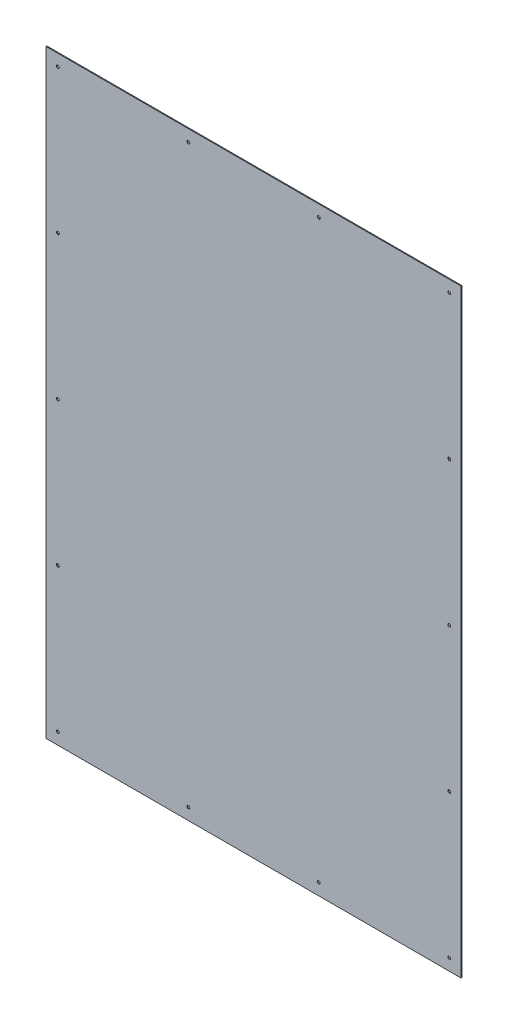
ISO-10303-21;
HEADER;
FILE_DESCRIPTION(('STEP AP214'),'2;1');
FILE_NAME('part.step','',(''),(''),'','','');
FILE_SCHEMA(('AUTOMOTIVE_DESIGN { 1 0 10303 214 1 1 1 1 }'));
ENDSEC;
DATA;
#1=APPLICATION_CONTEXT('core data for automotive mechanical design processes');
#2=APPLICATION_PROTOCOL_DEFINITION('international standard','automotive_design',2000,#1);
#3=PRODUCT_CONTEXT('',#1,'mechanical');
#4=PRODUCT('Part','Part','',(#3));
#5=PRODUCT_RELATED_PRODUCT_CATEGORY('part','',(#4));
#6=PRODUCT_DEFINITION_FORMATION('','',#4);
#7=PRODUCT_DEFINITION_CONTEXT('part definition',#1,'design');
#8=PRODUCT_DEFINITION('design','',#6,#7);
#9=PRODUCT_DEFINITION_SHAPE('','',#8);
#10=(LENGTH_UNIT() NAMED_UNIT(*) SI_UNIT(.MILLI.,.METRE.));
#11=(NAMED_UNIT(*) PLANE_ANGLE_UNIT() SI_UNIT($,.RADIAN.));
#12=(NAMED_UNIT(*) SI_UNIT($,.STERADIAN.) SOLID_ANGLE_UNIT());
#13=UNCERTAINTY_MEASURE_WITH_UNIT(LENGTH_MEASURE(1.E-05),#10,'distance_accuracy_value','');
#14=(GEOMETRIC_REPRESENTATION_CONTEXT(3) GLOBAL_UNCERTAINTY_ASSIGNED_CONTEXT((#13)) GLOBAL_UNIT_ASSIGNED_CONTEXT((#10,
#11,#12)) REPRESENTATION_CONTEXT('',''));
#15=CARTESIAN_POINT('',(0.,0.,0.));
#16=DIRECTION('',(0.,0.,1.));
#17=DIRECTION('',(1.,0.,0.));
#18=AXIS2_PLACEMENT_3D('',#15,#16,#17);
#19=CARTESIAN_POINT('',(450.,650.,1.9));
#20=DIRECTION('',(-1.,0.,0.));
#21=DIRECTION('',(0.,-1.,0.));
#22=AXIS2_PLACEMENT_3D('',#19,#20,#21);
#23=PLANE('',#22);
#24=DIRECTION('',(0.,1.,0.));
#25=VECTOR('',#24,1.);
#26=CARTESIAN_POINT('',(450.,650.,0.));
#27=LINE('',#26,#25);
#28=CARTESIAN_POINT('',(450.,-650.,0.));
#29=VERTEX_POINT('',#28);
#30=CARTESIAN_POINT('',(450.,650.,0.));
#31=VERTEX_POINT('',#30);
#32=EDGE_CURVE('E98',#29,#31,#27,.T.);
#33=ORIENTED_EDGE('',*,*,#32,.T.);
#34=DIRECTION('',(0.,0.,-1.));
#35=VECTOR('',#34,1.);
#36=CARTESIAN_POINT('',(450.,650.,1.9));
#37=LINE('',#36,#35);
#38=CARTESIAN_POINT('',(450.,650.,1.9));
#39=VERTEX_POINT('',#38);
#40=EDGE_CURVE('E11',#39,#31,#37,.T.);
#41=ORIENTED_EDGE('',*,*,#40,.F.);
#42=DIRECTION('',(0.,1.,0.));
#43=VECTOR('',#42,1.);
#44=CARTESIAN_POINT('',(450.,650.,1.9));
#45=LINE('',#44,#43);
#46=CARTESIAN_POINT('',(450.,-650.,1.9));
#47=VERTEX_POINT('',#46);
#48=EDGE_CURVE('E85',#47,#39,#45,.T.);
#49=ORIENTED_EDGE('',*,*,#48,.F.);
#50=DIRECTION('',(0.,0.,-1.));
#51=VECTOR('',#50,1.);
#52=CARTESIAN_POINT('',(450.,-650.,1.9));
#53=LINE('',#52,#51);
#54=EDGE_CURVE('E94',#47,#29,#53,.T.);
#55=ORIENTED_EDGE('',*,*,#54,.T.);
#56=EDGE_LOOP('',(#33,#41,#49,#55));
#57=FACE_BOUND('',#56,.T.);
#58=ADVANCED_FACE('F32',(#57),#23,.F.);
#59=CARTESIAN_POINT('',(-450.,650.,1.9));
#60=DIRECTION('',(0.,-1.,0.));
#61=DIRECTION('',(0.,0.,-1.));
#62=AXIS2_PLACEMENT_3D('',#59,#60,#61);
#63=PLANE('',#62);
#64=DIRECTION('',(-1.,0.,0.));
#65=VECTOR('',#64,1.);
#66=CARTESIAN_POINT('',(-450.,650.,0.));
#67=LINE('',#66,#65);
#68=CARTESIAN_POINT('',(-450.,650.,0.));
#69=VERTEX_POINT('',#68);
#70=EDGE_CURVE('E89',#31,#69,#67,.T.);
#71=ORIENTED_EDGE('',*,*,#70,.T.);
#72=DIRECTION('',(0.,0.,-1.));
#73=VECTOR('',#72,1.);
#74=CARTESIAN_POINT('',(-450.,650.,1.9));
#75=LINE('',#74,#73);
#76=CARTESIAN_POINT('',(-450.,650.,1.9));
#77=VERTEX_POINT('',#76);
#78=EDGE_CURVE('E41',#77,#69,#75,.T.);
#79=ORIENTED_EDGE('',*,*,#78,.F.);
#80=DIRECTION('',(-1.,0.,0.));
#81=VECTOR('',#80,1.);
#82=CARTESIAN_POINT('',(-450.,650.,1.9));
#83=LINE('',#82,#81);
#84=EDGE_CURVE('E80',#39,#77,#83,.T.);
#85=ORIENTED_EDGE('',*,*,#84,.F.);
#86=ORIENTED_EDGE('',*,*,#40,.T.);
#87=EDGE_LOOP('',(#71,#79,#85,#86));
#88=FACE_BOUND('',#87,.T.);
#89=ADVANCED_FACE('F88',(#88),#63,.F.);
#90=CARTESIAN_POINT('',(-450.,650.,1.9));
#91=DIRECTION('',(1.,0.,0.));
#92=DIRECTION('',(0.,1.,0.));
#93=AXIS2_PLACEMENT_3D('',#90,#91,#92);
#94=PLANE('',#93);
#95=DIRECTION('',(0.,-1.,0.));
#96=VECTOR('',#95,1.);
#97=CARTESIAN_POINT('',(-450.,650.,0.));
#98=LINE('',#97,#96);
#99=CARTESIAN_POINT('',(-450.,-650.,0.));
#100=VERTEX_POINT('',#99);
#101=EDGE_CURVE('E67',#69,#100,#98,.T.);
#102=ORIENTED_EDGE('',*,*,#101,.T.);
#103=DIRECTION('',(0.,0.,-1.));
#104=VECTOR('',#103,1.);
#105=CARTESIAN_POINT('',(-450.,-650.,1.9));
#106=LINE('',#105,#104);
#107=CARTESIAN_POINT('',(-450.,-650.,1.9));
#108=VERTEX_POINT('',#107);
#109=EDGE_CURVE('E90',#108,#100,#106,.T.);
#110=ORIENTED_EDGE('',*,*,#109,.F.);
#111=DIRECTION('',(0.,-1.,0.));
#112=VECTOR('',#111,1.);
#113=CARTESIAN_POINT('',(-450.,650.,1.9));
#114=LINE('',#113,#112);
#115=EDGE_CURVE('E83',#77,#108,#114,.T.);
#116=ORIENTED_EDGE('',*,*,#115,.F.);
#117=ORIENTED_EDGE('',*,*,#78,.T.);
#118=EDGE_LOOP('',(#102,#110,#116,#117));
#119=FACE_BOUND('',#118,.T.);
#120=ADVANCED_FACE('F92',(#119),#94,.F.);
#121=CARTESIAN_POINT('',(-450.,-650.,1.9));
#122=DIRECTION('',(0.,1.,0.));
#123=DIRECTION('',(0.,0.,1.));
#124=AXIS2_PLACEMENT_3D('',#121,#122,#123);
#125=PLANE('',#124);
#126=DIRECTION('',(1.,0.,0.));
#127=VECTOR('',#126,1.);
#128=CARTESIAN_POINT('',(-450.,-650.,0.));
#129=LINE('',#128,#127);
#130=EDGE_CURVE('E73',#100,#29,#129,.T.);
#131=ORIENTED_EDGE('',*,*,#130,.T.);
#132=ORIENTED_EDGE('',*,*,#54,.F.);
#133=DIRECTION('',(1.,0.,0.));
#134=VECTOR('',#133,1.);
#135=CARTESIAN_POINT('',(-450.,-650.,1.9));
#136=LINE('',#135,#134);
#137=EDGE_CURVE('E50',#108,#47,#136,.T.);
#138=ORIENTED_EDGE('',*,*,#137,.F.);
#139=ORIENTED_EDGE('',*,*,#109,.T.);
#140=EDGE_LOOP('',(#131,#132,#138,#139));
#141=FACE_BOUND('',#140,.T.);
#142=ADVANCED_FACE('F200',(#141),#125,.F.);
#143=CARTESIAN_POINT('',(0.,0.,1.9));
#144=DIRECTION('',(0.,0.,1.));
#145=DIRECTION('',(1.,0.,0.));
#146=AXIS2_PLACEMENT_3D('',#143,#144,#145);
#147=PLANE('',#146);
#148=CARTESIAN_POINT('',(141.54,-624.6,1.9));
#149=DIRECTION('',(0.,0.,1.));
#150=DIRECTION('',(-1.,0.,0.));
#151=AXIS2_PLACEMENT_3D('',#148,#149,#150);
#152=CIRCLE('',#151,3.175);
#153=CARTESIAN_POINT('',(138.365,-624.6,1.9));
#154=VERTEX_POINT('',#153);
#155=EDGE_CURVE('E168',#154,#154,#152,.T.);
#156=ORIENTED_EDGE('',*,*,#155,.F.);
#157=EDGE_LOOP('',(#156));
#158=FACE_BOUND('',#157,.T.);
#159=CARTESIAN_POINT('',(424.6,-1.11022302462516E-13,1.9));
#160=DIRECTION('',(0.,0.,1.));
#161=DIRECTION('',(1.,0.,0.));
#162=AXIS2_PLACEMENT_3D('',#159,#160,#161);
#163=CIRCLE('',#162,3.17499999999997);
#164=CARTESIAN_POINT('',(427.775,-1.11022302462516E-13,1.9));
#165=VERTEX_POINT('',#164);
#166=EDGE_CURVE('E176',#165,#165,#163,.T.);
#167=ORIENTED_EDGE('',*,*,#166,.F.);
#168=EDGE_LOOP('',(#167));
#169=FACE_BOUND('',#168,.T.);
#170=CARTESIAN_POINT('',(424.6,312.3,1.9));
#171=DIRECTION('',(0.,0.,1.));
#172=DIRECTION('',(1.,0.,0.));
#173=AXIS2_PLACEMENT_3D('',#170,#171,#172);
#174=CIRCLE('',#173,3.17499999999997);
#175=CARTESIAN_POINT('',(427.775,312.3,1.9));
#176=VERTEX_POINT('',#175);
#177=EDGE_CURVE('E173',#176,#176,#174,.T.);
#178=ORIENTED_EDGE('',*,*,#177,.F.);
#179=EDGE_LOOP('',(#178));
#180=FACE_BOUND('',#179,.T.);
#181=CARTESIAN_POINT('',(424.6,-312.3,1.9));
#182=DIRECTION('',(0.,0.,1.));
#183=DIRECTION('',(1.,0.,0.));
#184=AXIS2_PLACEMENT_3D('',#181,#182,#183);
#185=CIRCLE('',#184,3.17499999999997);
#186=CARTESIAN_POINT('',(427.775,-312.3,1.9));
#187=VERTEX_POINT('',#186);
#188=EDGE_CURVE('E177',#187,#187,#185,.T.);
#189=ORIENTED_EDGE('',*,*,#188,.F.);
#190=EDGE_LOOP('',(#189));
#191=FACE_BOUND('',#190,.T.);
#192=CARTESIAN_POINT('',(-424.6,-312.3,1.9));
#193=DIRECTION('',(0.,0.,1.));
#194=DIRECTION('',(-1.,0.,0.));
#195=AXIS2_PLACEMENT_3D('',#192,#193,#194);
#196=CIRCLE('',#195,3.17499999999997);
#197=CARTESIAN_POINT('',(-427.775,-312.3,1.9));
#198=VERTEX_POINT('',#197);
#199=EDGE_CURVE('E188',#198,#198,#196,.T.);
#200=ORIENTED_EDGE('',*,*,#199,.F.);
#201=EDGE_LOOP('',(#200));
#202=FACE_BOUND('',#201,.T.);
#203=CARTESIAN_POINT('',(-424.6,-1.11022302462516E-13,1.9));
#204=DIRECTION('',(0.,0.,1.));
#205=DIRECTION('',(-1.,0.,0.));
#206=AXIS2_PLACEMENT_3D('',#203,#204,#205);
#207=CIRCLE('',#206,3.17500000000005);
#208=CARTESIAN_POINT('',(-427.775,-1.11022302462516E-13,1.9));
#209=VERTEX_POINT('',#208);
#210=EDGE_CURVE('E185',#209,#209,#207,.T.);
#211=ORIENTED_EDGE('',*,*,#210,.F.);
#212=EDGE_LOOP('',(#211));
#213=FACE_BOUND('',#212,.T.);
#214=CARTESIAN_POINT('',(-424.6,312.3,1.9));
#215=DIRECTION('',(0.,0.,1.));
#216=DIRECTION('',(-1.,0.,0.));
#217=AXIS2_PLACEMENT_3D('',#214,#215,#216);
#218=CIRCLE('',#217,3.17499999999997);
#219=CARTESIAN_POINT('',(-427.775,312.3,1.9));
#220=VERTEX_POINT('',#219);
#221=EDGE_CURVE('E182',#220,#220,#218,.T.);
#222=ORIENTED_EDGE('',*,*,#221,.F.);
#223=EDGE_LOOP('',(#222));
#224=FACE_BOUND('',#223,.T.);
#225=CARTESIAN_POINT('',(424.6,-624.6,1.9));
#226=DIRECTION('',(0.,0.,1.));
#227=DIRECTION('',(-1.,0.,0.));
#228=AXIS2_PLACEMENT_3D('',#225,#226,#227);
#229=CIRCLE('',#228,3.17499999999979);
#230=CARTESIAN_POINT('',(421.425,-624.6,1.9));
#231=VERTEX_POINT('',#230);
#232=EDGE_CURVE('E114',#231,#231,#229,.T.);
#233=ORIENTED_EDGE('',*,*,#232,.F.);
#234=EDGE_LOOP('',(#233));
#235=FACE_BOUND('',#234,.T.);
#236=CARTESIAN_POINT('',(-424.6,-624.6,1.9));
#237=DIRECTION('',(0.,0.,1.));
#238=DIRECTION('',(1.,0.,0.));
#239=AXIS2_PLACEMENT_3D('',#236,#237,#238);
#240=CIRCLE('',#239,3.17499999999995);
#241=CARTESIAN_POINT('',(-421.425,-624.6,1.9));
#242=VERTEX_POINT('',#241);
#243=EDGE_CURVE('E158',#242,#242,#240,.T.);
#244=ORIENTED_EDGE('',*,*,#243,.F.);
#245=EDGE_LOOP('',(#244));
#246=FACE_BOUND('',#245,.T.);
#247=CARTESIAN_POINT('',(-424.6,624.6,1.9));
#248=DIRECTION('',(0.,0.,1.));
#249=DIRECTION('',(-1.,0.,0.));
#250=AXIS2_PLACEMENT_3D('',#247,#248,#249);
#251=CIRCLE('',#250,3.17499999999992);
#252=CARTESIAN_POINT('',(-427.775,624.6,1.9));
#253=VERTEX_POINT('',#252);
#254=EDGE_CURVE('E155',#253,#253,#251,.T.);
#255=ORIENTED_EDGE('',*,*,#254,.F.);
#256=EDGE_LOOP('',(#255));
#257=FACE_BOUND('',#256,.T.);
#258=CARTESIAN_POINT('',(141.54,624.6,1.9));
#259=DIRECTION('',(0.,0.,1.));
#260=DIRECTION('',(1.,0.,0.));
#261=AXIS2_PLACEMENT_3D('',#258,#259,#260);
#262=CIRCLE('',#261,3.175);
#263=CARTESIAN_POINT('',(144.715,624.6,1.9));
#264=VERTEX_POINT('',#263);
#265=EDGE_CURVE('E159',#264,#264,#262,.T.);
#266=ORIENTED_EDGE('',*,*,#265,.F.);
#267=EDGE_LOOP('',(#266));
#268=FACE_BOUND('',#267,.T.);
#269=CARTESIAN_POINT('',(-141.52,624.6,1.9));
#270=DIRECTION('',(0.,0.,1.));
#271=DIRECTION('',(1.,0.,0.));
#272=AXIS2_PLACEMENT_3D('',#269,#270,#271);
#273=CIRCLE('',#272,3.175);
#274=CARTESIAN_POINT('',(-138.345,624.6,1.9));
#275=VERTEX_POINT('',#274);
#276=EDGE_CURVE('E167',#275,#275,#273,.T.);
#277=ORIENTED_EDGE('',*,*,#276,.F.);
#278=EDGE_LOOP('',(#277));
#279=FACE_BOUND('',#278,.T.);
#280=CARTESIAN_POINT('',(-141.52,-624.6,1.9));
#281=DIRECTION('',(0.,0.,1.));
#282=DIRECTION('',(-1.,0.,0.));
#283=AXIS2_PLACEMENT_3D('',#280,#281,#282);
#284=CIRCLE('',#283,3.175);
#285=CARTESIAN_POINT('',(-144.695,-624.6,1.9));
#286=VERTEX_POINT('',#285);
#287=EDGE_CURVE('E164',#286,#286,#284,.T.);
#288=ORIENTED_EDGE('',*,*,#287,.F.);
#289=EDGE_LOOP('',(#288));
#290=FACE_BOUND('',#289,.T.);
#291=CARTESIAN_POINT('',(424.6,624.6,1.9));
#292=DIRECTION('',(0.,0.,1.));
#293=DIRECTION('',(1.,0.,0.));
#294=AXIS2_PLACEMENT_3D('',#291,#292,#293);
#295=CIRCLE('',#294,3.17499999999997);
#296=CARTESIAN_POINT('',(427.775,624.6,1.9));
#297=VERTEX_POINT('',#296);
#298=EDGE_CURVE('E109',#297,#297,#295,.T.);
#299=ORIENTED_EDGE('',*,*,#298,.F.);
#300=EDGE_LOOP('',(#299));
#301=FACE_BOUND('',#300,.T.);
#302=ORIENTED_EDGE('',*,*,#48,.T.);
#303=ORIENTED_EDGE('',*,*,#84,.T.);
#304=ORIENTED_EDGE('',*,*,#115,.T.);
#305=ORIENTED_EDGE('',*,*,#137,.T.);
#306=EDGE_LOOP('',(#302,#303,#304,#305));
#307=FACE_BOUND('',#306,.T.);
#308=ADVANCED_FACE('F81',(#158,#169,#180,#191,#202,#213,#224,#235,#246,#257,#268,#279,#290,#301,
#307),#147,.T.);
#309=CARTESIAN_POINT('',(0.,0.,0.));
#310=DIRECTION('',(0.,0.,1.));
#311=DIRECTION('',(1.,0.,0.));
#312=AXIS2_PLACEMENT_3D('',#309,#310,#311);
#313=PLANE('',#312);
#314=CARTESIAN_POINT('',(141.54,-624.6,0.));
#315=DIRECTION('',(0.,0.,1.));
#316=DIRECTION('',(1.,0.,0.));
#317=AXIS2_PLACEMENT_3D('',#314,#315,#316);
#318=CIRCLE('',#317,3.175);
#319=CARTESIAN_POINT('',(144.715,-624.6,0.));
#320=VERTEX_POINT('',#319);
#321=EDGE_CURVE('E35',#320,#320,#318,.T.);
#322=ORIENTED_EDGE('',*,*,#321,.T.);
#323=EDGE_LOOP('',(#322));
#324=FACE_BOUND('',#323,.T.);
#325=CARTESIAN_POINT('',(424.6,-1.11022302462516E-13,0.));
#326=DIRECTION('',(0.,0.,1.));
#327=DIRECTION('',(1.,0.,0.));
#328=AXIS2_PLACEMENT_3D('',#325,#326,#327);
#329=CIRCLE('',#328,3.17499999999997);
#330=CARTESIAN_POINT('',(427.775,-1.11022302462516E-13,0.));
#331=VERTEX_POINT('',#330);
#332=EDGE_CURVE('E143',#331,#331,#329,.T.);
#333=ORIENTED_EDGE('',*,*,#332,.T.);
#334=EDGE_LOOP('',(#333));
#335=FACE_BOUND('',#334,.T.);
#336=CARTESIAN_POINT('',(424.6,312.3,0.));
#337=DIRECTION('',(0.,0.,1.));
#338=DIRECTION('',(1.,0.,0.));
#339=AXIS2_PLACEMENT_3D('',#336,#337,#338);
#340=CIRCLE('',#339,3.17499999999997);
#341=CARTESIAN_POINT('',(427.775,312.3,0.));
#342=VERTEX_POINT('',#341);
#343=EDGE_CURVE('E141',#342,#342,#340,.T.);
#344=ORIENTED_EDGE('',*,*,#343,.T.);
#345=EDGE_LOOP('',(#344));
#346=FACE_BOUND('',#345,.T.);
#347=CARTESIAN_POINT('',(424.6,-312.3,0.));
#348=DIRECTION('',(0.,0.,1.));
#349=DIRECTION('',(1.,0.,0.));
#350=AXIS2_PLACEMENT_3D('',#347,#348,#349);
#351=CIRCLE('',#350,3.17499999999997);
#352=CARTESIAN_POINT('',(427.775,-312.3,0.));
#353=VERTEX_POINT('',#352);
#354=EDGE_CURVE('E138',#353,#353,#351,.T.);
#355=ORIENTED_EDGE('',*,*,#354,.T.);
#356=EDGE_LOOP('',(#355));
#357=FACE_BOUND('',#356,.T.);
#358=CARTESIAN_POINT('',(-424.6,-312.3,0.));
#359=DIRECTION('',(0.,0.,1.));
#360=DIRECTION('',(1.,0.,0.));
#361=AXIS2_PLACEMENT_3D('',#358,#359,#360);
#362=CIRCLE('',#361,3.17499999999997);
#363=CARTESIAN_POINT('',(-421.425,-312.3,0.));
#364=VERTEX_POINT('',#363);
#365=EDGE_CURVE('E135',#364,#364,#362,.T.);
#366=ORIENTED_EDGE('',*,*,#365,.T.);
#367=EDGE_LOOP('',(#366));
#368=FACE_BOUND('',#367,.T.);
#369=CARTESIAN_POINT('',(-424.6,-1.11022302462516E-13,0.));
#370=DIRECTION('',(0.,0.,1.));
#371=DIRECTION('',(1.,0.,0.));
#372=AXIS2_PLACEMENT_3D('',#369,#370,#371);
#373=CIRCLE('',#372,3.17500000000005);
#374=CARTESIAN_POINT('',(-421.425,-1.11022302462516E-13,0.));
#375=VERTEX_POINT('',#374);
#376=EDGE_CURVE('E132',#375,#375,#373,.T.);
#377=ORIENTED_EDGE('',*,*,#376,.T.);
#378=EDGE_LOOP('',(#377));
#379=FACE_BOUND('',#378,.T.);
#380=CARTESIAN_POINT('',(-424.6,312.3,0.));
#381=DIRECTION('',(0.,0.,1.));
#382=DIRECTION('',(1.,0.,0.));
#383=AXIS2_PLACEMENT_3D('',#380,#381,#382);
#384=CIRCLE('',#383,3.17499999999997);
#385=CARTESIAN_POINT('',(-421.425,312.3,0.));
#386=VERTEX_POINT('',#385);
#387=EDGE_CURVE('E129',#386,#386,#384,.T.);
#388=ORIENTED_EDGE('',*,*,#387,.T.);
#389=EDGE_LOOP('',(#388));
#390=FACE_BOUND('',#389,.T.);
#391=CARTESIAN_POINT('',(424.6,-624.6,0.));
#392=DIRECTION('',(0.,0.,1.));
#393=DIRECTION('',(1.,0.,0.));
#394=AXIS2_PLACEMENT_3D('',#391,#392,#393);
#395=CIRCLE('',#394,3.17499999999979);
#396=CARTESIAN_POINT('',(427.775,-624.6,0.));
#397=VERTEX_POINT('',#396);
#398=EDGE_CURVE('E126',#397,#397,#395,.T.);
#399=ORIENTED_EDGE('',*,*,#398,.T.);
#400=EDGE_LOOP('',(#399));
#401=FACE_BOUND('',#400,.T.);
#402=CARTESIAN_POINT('',(-424.6,-624.6,0.));
#403=DIRECTION('',(0.,0.,1.));
#404=DIRECTION('',(1.,0.,0.));
#405=AXIS2_PLACEMENT_3D('',#402,#403,#404);
#406=CIRCLE('',#405,3.17499999999995);
#407=CARTESIAN_POINT('',(-421.425,-624.6,0.));
#408=VERTEX_POINT('',#407);
#409=EDGE_CURVE('E123',#408,#408,#406,.T.);
#410=ORIENTED_EDGE('',*,*,#409,.T.);
#411=EDGE_LOOP('',(#410));
#412=FACE_BOUND('',#411,.T.);
#413=CARTESIAN_POINT('',(-424.6,624.6,0.));
#414=DIRECTION('',(0.,0.,1.));
#415=DIRECTION('',(1.,0.,0.));
#416=AXIS2_PLACEMENT_3D('',#413,#414,#415);
#417=CIRCLE('',#416,3.17499999999992);
#418=CARTESIAN_POINT('',(-421.425,624.6,0.));
#419=VERTEX_POINT('',#418);
#420=EDGE_CURVE('E120',#419,#419,#417,.T.);
#421=ORIENTED_EDGE('',*,*,#420,.T.);
#422=EDGE_LOOP('',(#421));
#423=FACE_BOUND('',#422,.T.);
#424=CARTESIAN_POINT('',(141.54,624.6,0.));
#425=DIRECTION('',(0.,0.,1.));
#426=DIRECTION('',(1.,0.,0.));
#427=AXIS2_PLACEMENT_3D('',#424,#425,#426);
#428=CIRCLE('',#427,3.175);
#429=CARTESIAN_POINT('',(144.715,624.6,0.));
#430=VERTEX_POINT('',#429);
#431=EDGE_CURVE('E117',#430,#430,#428,.T.);
#432=ORIENTED_EDGE('',*,*,#431,.T.);
#433=EDGE_LOOP('',(#432));
#434=FACE_BOUND('',#433,.T.);
#435=CARTESIAN_POINT('',(-141.52,624.6,0.));
#436=DIRECTION('',(0.,0.,1.));
#437=DIRECTION('',(1.,0.,0.));
#438=AXIS2_PLACEMENT_3D('',#435,#436,#437);
#439=CIRCLE('',#438,3.175);
#440=CARTESIAN_POINT('',(-138.345,624.6,0.));
#441=VERTEX_POINT('',#440);
#442=EDGE_CURVE('E113',#441,#441,#439,.T.);
#443=ORIENTED_EDGE('',*,*,#442,.T.);
#444=EDGE_LOOP('',(#443));
#445=FACE_BOUND('',#444,.T.);
#446=CARTESIAN_POINT('',(-141.52,-624.6,0.));
#447=DIRECTION('',(0.,0.,1.));
#448=DIRECTION('',(1.,0.,0.));
#449=AXIS2_PLACEMENT_3D('',#446,#447,#448);
#450=CIRCLE('',#449,3.175);
#451=CARTESIAN_POINT('',(-138.345,-624.6,0.));
#452=VERTEX_POINT('',#451);
#453=EDGE_CURVE('E110',#452,#452,#450,.T.);
#454=ORIENTED_EDGE('',*,*,#453,.T.);
#455=EDGE_LOOP('',(#454));
#456=FACE_BOUND('',#455,.T.);
#457=CARTESIAN_POINT('',(424.6,624.6,0.));
#458=DIRECTION('',(0.,0.,1.));
#459=DIRECTION('',(1.,0.,0.));
#460=AXIS2_PLACEMENT_3D('',#457,#458,#459);
#461=CIRCLE('',#460,3.17499999999997);
#462=CARTESIAN_POINT('',(427.775,624.6,0.));
#463=VERTEX_POINT('',#462);
#464=EDGE_CURVE('E101',#463,#463,#461,.T.);
#465=ORIENTED_EDGE('',*,*,#464,.T.);
#466=EDGE_LOOP('',(#465));
#467=FACE_BOUND('',#466,.T.);
#468=ORIENTED_EDGE('',*,*,#32,.F.);
#469=ORIENTED_EDGE('',*,*,#130,.F.);
#470=ORIENTED_EDGE('',*,*,#101,.F.);
#471=ORIENTED_EDGE('',*,*,#70,.F.);
#472=EDGE_LOOP('',(#468,#469,#470,#471));
#473=FACE_BOUND('',#472,.T.);
#474=ADVANCED_FACE('F199',(#324,#335,#346,#357,#368,#379,#390,#401,#412,#423,#434,#445,#456,
#467,#473),#313,.F.);
#475=CARTESIAN_POINT('',(424.6,624.6,-8.1));
#476=DIRECTION('',(0.,0.,1.));
#477=DIRECTION('',(1.,0.,0.));
#478=AXIS2_PLACEMENT_3D('',#475,#476,#477);
#479=CYLINDRICAL_SURFACE('',#478,3.17499999999997);
#480=ORIENTED_EDGE('',*,*,#298,.T.);
#481=EDGE_LOOP('',(#480));
#482=FACE_BOUND('',#481,.T.);
#483=ORIENTED_EDGE('',*,*,#464,.F.);
#484=EDGE_LOOP('',(#483));
#485=FACE_BOUND('',#484,.T.);
#486=ADVANCED_FACE('F226',(#482,#485),#479,.F.);
#487=CARTESIAN_POINT('',(-141.52,-624.6,-8.1));
#488=DIRECTION('',(0.,0.,1.));
#489=DIRECTION('',(1.,0.,0.));
#490=AXIS2_PLACEMENT_3D('',#487,#488,#489);
#491=CYLINDRICAL_SURFACE('',#490,3.175);
#492=ORIENTED_EDGE('',*,*,#287,.T.);
#493=EDGE_LOOP('',(#492));
#494=FACE_BOUND('',#493,.T.);
#495=ORIENTED_EDGE('',*,*,#453,.F.);
#496=EDGE_LOOP('',(#495));
#497=FACE_BOUND('',#496,.T.);
#498=ADVANCED_FACE('F222',(#494,#497),#491,.F.);
#499=CARTESIAN_POINT('',(-141.52,624.6,-8.1));
#500=DIRECTION('',(0.,0.,1.));
#501=DIRECTION('',(1.,0.,0.));
#502=AXIS2_PLACEMENT_3D('',#499,#500,#501);
#503=CYLINDRICAL_SURFACE('',#502,3.175);
#504=ORIENTED_EDGE('',*,*,#276,.T.);
#505=EDGE_LOOP('',(#504));
#506=FACE_BOUND('',#505,.T.);
#507=ORIENTED_EDGE('',*,*,#442,.F.);
#508=EDGE_LOOP('',(#507));
#509=FACE_BOUND('',#508,.T.);
#510=ADVANCED_FACE('F225',(#506,#509),#503,.F.);
#511=CARTESIAN_POINT('',(141.54,624.6,-8.1));
#512=DIRECTION('',(0.,0.,1.));
#513=DIRECTION('',(1.,0.,0.));
#514=AXIS2_PLACEMENT_3D('',#511,#512,#513);
#515=CYLINDRICAL_SURFACE('',#514,3.175);
#516=ORIENTED_EDGE('',*,*,#265,.T.);
#517=EDGE_LOOP('',(#516));
#518=FACE_BOUND('',#517,.T.);
#519=ORIENTED_EDGE('',*,*,#431,.F.);
#520=EDGE_LOOP('',(#519));
#521=FACE_BOUND('',#520,.T.);
#522=ADVANCED_FACE('F292',(#518,#521),#515,.F.);
#523=CARTESIAN_POINT('',(-424.6,624.6,-8.1));
#524=DIRECTION('',(0.,0.,1.));
#525=DIRECTION('',(1.,0.,0.));
#526=AXIS2_PLACEMENT_3D('',#523,#524,#525);
#527=CYLINDRICAL_SURFACE('',#526,3.17499999999992);
#528=ORIENTED_EDGE('',*,*,#254,.T.);
#529=EDGE_LOOP('',(#528));
#530=FACE_BOUND('',#529,.T.);
#531=ORIENTED_EDGE('',*,*,#420,.F.);
#532=EDGE_LOOP('',(#531));
#533=FACE_BOUND('',#532,.T.);
#534=ADVANCED_FACE('F302',(#530,#533),#527,.F.);
#535=CARTESIAN_POINT('',(-424.6,-624.6,-8.1));
#536=DIRECTION('',(0.,0.,1.));
#537=DIRECTION('',(1.,0.,0.));
#538=AXIS2_PLACEMENT_3D('',#535,#536,#537);
#539=CYLINDRICAL_SURFACE('',#538,3.17499999999995);
#540=ORIENTED_EDGE('',*,*,#243,.T.);
#541=EDGE_LOOP('',(#540));
#542=FACE_BOUND('',#541,.T.);
#543=ORIENTED_EDGE('',*,*,#409,.F.);
#544=EDGE_LOOP('',(#543));
#545=FACE_BOUND('',#544,.T.);
#546=ADVANCED_FACE('F312',(#542,#545),#539,.F.);
#547=CARTESIAN_POINT('',(424.6,-624.6,-8.1));
#548=DIRECTION('',(0.,0.,1.));
#549=DIRECTION('',(1.,0.,0.));
#550=AXIS2_PLACEMENT_3D('',#547,#548,#549);
#551=CYLINDRICAL_SURFACE('',#550,3.17499999999979);
#552=ORIENTED_EDGE('',*,*,#232,.T.);
#553=EDGE_LOOP('',(#552));
#554=FACE_BOUND('',#553,.T.);
#555=ORIENTED_EDGE('',*,*,#398,.F.);
#556=EDGE_LOOP('',(#555));
#557=FACE_BOUND('',#556,.T.);
#558=ADVANCED_FACE('F322',(#554,#557),#551,.F.);
#559=CARTESIAN_POINT('',(-424.6,312.3,-8.1));
#560=DIRECTION('',(0.,0.,1.));
#561=DIRECTION('',(1.,0.,0.));
#562=AXIS2_PLACEMENT_3D('',#559,#560,#561);
#563=CYLINDRICAL_SURFACE('',#562,3.17499999999997);
#564=ORIENTED_EDGE('',*,*,#221,.T.);
#565=EDGE_LOOP('',(#564));
#566=FACE_BOUND('',#565,.T.);
#567=ORIENTED_EDGE('',*,*,#387,.F.);
#568=EDGE_LOOP('',(#567));
#569=FACE_BOUND('',#568,.T.);
#570=ADVANCED_FACE('F332',(#566,#569),#563,.F.);
#571=CARTESIAN_POINT('',(-424.6,-1.11022302462516E-13,-8.1));
#572=DIRECTION('',(0.,0.,1.));
#573=DIRECTION('',(1.,0.,0.));
#574=AXIS2_PLACEMENT_3D('',#571,#572,#573);
#575=CYLINDRICAL_SURFACE('',#574,3.17500000000005);
#576=ORIENTED_EDGE('',*,*,#210,.T.);
#577=EDGE_LOOP('',(#576));
#578=FACE_BOUND('',#577,.T.);
#579=ORIENTED_EDGE('',*,*,#376,.F.);
#580=EDGE_LOOP('',(#579));
#581=FACE_BOUND('',#580,.T.);
#582=ADVANCED_FACE('F342',(#578,#581),#575,.F.);
#583=CARTESIAN_POINT('',(-424.6,-312.3,-8.1));
#584=DIRECTION('',(0.,0.,1.));
#585=DIRECTION('',(1.,0.,0.));
#586=AXIS2_PLACEMENT_3D('',#583,#584,#585);
#587=CYLINDRICAL_SURFACE('',#586,3.17499999999997);
#588=ORIENTED_EDGE('',*,*,#199,.T.);
#589=EDGE_LOOP('',(#588));
#590=FACE_BOUND('',#589,.T.);
#591=ORIENTED_EDGE('',*,*,#365,.F.);
#592=EDGE_LOOP('',(#591));
#593=FACE_BOUND('',#592,.T.);
#594=ADVANCED_FACE('F352',(#590,#593),#587,.F.);
#595=CARTESIAN_POINT('',(424.6,-312.3,-8.1));
#596=DIRECTION('',(0.,0.,1.));
#597=DIRECTION('',(1.,0.,0.));
#598=AXIS2_PLACEMENT_3D('',#595,#596,#597);
#599=CYLINDRICAL_SURFACE('',#598,3.17499999999997);
#600=ORIENTED_EDGE('',*,*,#188,.T.);
#601=EDGE_LOOP('',(#600));
#602=FACE_BOUND('',#601,.T.);
#603=ORIENTED_EDGE('',*,*,#354,.F.);
#604=EDGE_LOOP('',(#603));
#605=FACE_BOUND('',#604,.T.);
#606=ADVANCED_FACE('F194',(#602,#605),#599,.F.);
#607=CARTESIAN_POINT('',(424.6,312.3,-8.1));
#608=DIRECTION('',(0.,0.,1.));
#609=DIRECTION('',(1.,0.,0.));
#610=AXIS2_PLACEMENT_3D('',#607,#608,#609);
#611=CYLINDRICAL_SURFACE('',#610,3.17499999999997);
#612=ORIENTED_EDGE('',*,*,#177,.T.);
#613=EDGE_LOOP('',(#612));
#614=FACE_BOUND('',#613,.T.);
#615=ORIENTED_EDGE('',*,*,#343,.F.);
#616=EDGE_LOOP('',(#615));
#617=FACE_BOUND('',#616,.T.);
#618=ADVANCED_FACE('F371',(#614,#617),#611,.F.);
#619=CARTESIAN_POINT('',(424.6,-1.11022302462516E-13,-8.1));
#620=DIRECTION('',(0.,0.,1.));
#621=DIRECTION('',(1.,0.,0.));
#622=AXIS2_PLACEMENT_3D('',#619,#620,#621);
#623=CYLINDRICAL_SURFACE('',#622,3.17499999999997);
#624=ORIENTED_EDGE('',*,*,#166,.T.);
#625=EDGE_LOOP('',(#624));
#626=FACE_BOUND('',#625,.T.);
#627=ORIENTED_EDGE('',*,*,#332,.F.);
#628=EDGE_LOOP('',(#627));
#629=FACE_BOUND('',#628,.T.);
#630=ADVANCED_FACE('F380',(#626,#629),#623,.F.);
#631=CARTESIAN_POINT('',(141.54,-624.6,-8.1));
#632=DIRECTION('',(0.,0.,1.));
#633=DIRECTION('',(1.,0.,0.));
#634=AXIS2_PLACEMENT_3D('',#631,#632,#633);
#635=CYLINDRICAL_SURFACE('',#634,3.175);
#636=ORIENTED_EDGE('',*,*,#155,.T.);
#637=EDGE_LOOP('',(#636));
#638=FACE_BOUND('',#637,.T.);
#639=ORIENTED_EDGE('',*,*,#321,.F.);
#640=EDGE_LOOP('',(#639));
#641=FACE_BOUND('',#640,.T.);
#642=ADVANCED_FACE('F390',(#638,#641),#635,.F.);
#643=CLOSED_SHELL('',(#58,#89,#120,#142,#308,#474,#486,#498,#510,#522,#534,#546,#558,#570,#582,
#594,#606,#618,#630,#642));
#644=MANIFOLD_SOLID_BREP('B2',#643);
#645=ADVANCED_BREP_SHAPE_REPRESENTATION('',(#18,#644),#14);
#646=SHAPE_DEFINITION_REPRESENTATION(#9,#645);
ENDSEC;
END-ISO-10303-21;
